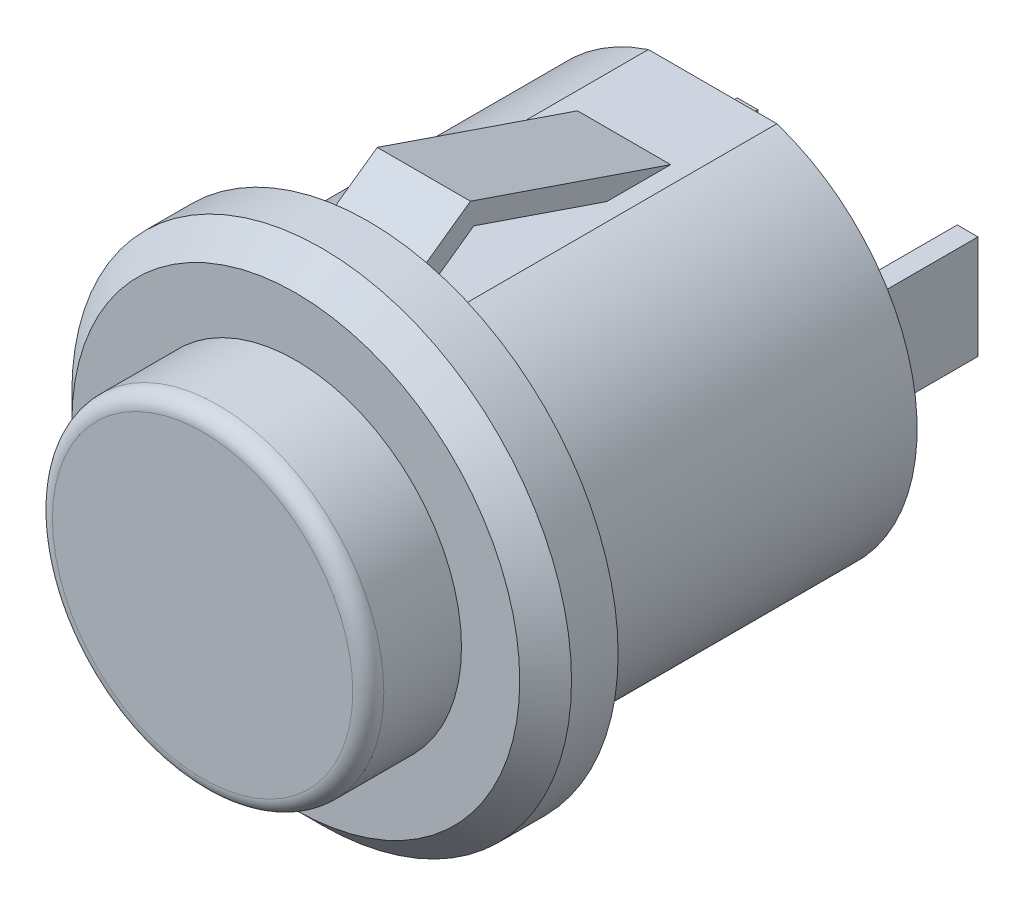
ISO-10303-21;
HEADER;
FILE_DESCRIPTION(('STEP AP214'),'2;1');
FILE_NAME('part.step','',(''),(''),'','','');
FILE_SCHEMA(('AUTOMOTIVE_DESIGN { 1 0 10303 214 1 1 1 1 }'));
ENDSEC;
DATA;
#1=APPLICATION_CONTEXT('core data for automotive mechanical design processes');
#2=APPLICATION_PROTOCOL_DEFINITION('international standard','automotive_design',2000,#1);
#3=PRODUCT_CONTEXT('',#1,'mechanical');
#4=PRODUCT('Part','Part','',(#3));
#5=PRODUCT_RELATED_PRODUCT_CATEGORY('part','',(#4));
#6=PRODUCT_DEFINITION_FORMATION('','',#4);
#7=PRODUCT_DEFINITION_CONTEXT('part definition',#1,'design');
#8=PRODUCT_DEFINITION('design','',#6,#7);
#9=PRODUCT_DEFINITION_SHAPE('','',#8);
#10=(LENGTH_UNIT() NAMED_UNIT(*) SI_UNIT(.MILLI.,.METRE.));
#11=(NAMED_UNIT(*) PLANE_ANGLE_UNIT() SI_UNIT($,.RADIAN.));
#12=(NAMED_UNIT(*) SI_UNIT($,.STERADIAN.) SOLID_ANGLE_UNIT());
#13=UNCERTAINTY_MEASURE_WITH_UNIT(LENGTH_MEASURE(1.E-05),#10,'distance_accuracy_value','');
#14=(GEOMETRIC_REPRESENTATION_CONTEXT(3) GLOBAL_UNCERTAINTY_ASSIGNED_CONTEXT((#13)) GLOBAL_UNIT_ASSIGNED_CONTEXT((#10,
#11,#12)) REPRESENTATION_CONTEXT('',''));
#15=CARTESIAN_POINT('',(0.,0.,0.));
#16=DIRECTION('',(0.,0.,1.));
#17=DIRECTION('',(1.,0.,0.));
#18=AXIS2_PLACEMENT_3D('',#15,#16,#17);
#19=CARTESIAN_POINT('',(0.,0.,0.));
#20=DIRECTION('',(0.,0.,1.));
#21=DIRECTION('',(1.,0.,0.));
#22=AXIS2_PLACEMENT_3D('',#19,#20,#21);
#23=PLANE('',#22);
#24=DIRECTION('',(0.,1.,0.));
#25=VECTOR('',#24,1.);
#26=CARTESIAN_POINT('',(-1.8,0.,0.));
#27=LINE('',#26,#25);
#28=CARTESIAN_POINT('',(-1.8,-8.62096384227763,0.));
#29=VERTEX_POINT('',#28);
#30=CARTESIAN_POINT('',(-1.8,-7.63980806123841,0.));
#31=VERTEX_POINT('',#30);
#32=EDGE_CURVE('E287',#29,#31,#27,.T.);
#33=ORIENTED_EDGE('',*,*,#32,.F.);
#34=DIRECTION('',(1.,0.,0.));
#35=VECTOR('',#34,1.);
#36=CARTESIAN_POINT('',(-1.8,-8.62096384227763,0.));
#37=LINE('',#36,#35);
#38=CARTESIAN_POINT('',(1.8,-8.62096384227763,0.));
#39=VERTEX_POINT('',#38);
#40=EDGE_CURVE('E307',#29,#39,#37,.T.);
#41=ORIENTED_EDGE('',*,*,#40,.T.);
#42=DIRECTION('',(0.,1.,0.));
#43=VECTOR('',#42,1.);
#44=CARTESIAN_POINT('',(1.8,0.,0.));
#45=LINE('',#44,#43);
#46=CARTESIAN_POINT('',(1.8,-7.63980806123841,0.));
#47=VERTEX_POINT('',#46);
#48=EDGE_CURVE('E264',#39,#47,#45,.T.);
#49=ORIENTED_EDGE('',*,*,#48,.T.);
#50=DIRECTION('',(1.,0.,0.));
#51=VECTOR('',#50,1.);
#52=CARTESIAN_POINT('',(-1.8,-7.63980806123841,0.));
#53=LINE('',#52,#51);
#54=EDGE_CURVE('E311',#31,#47,#53,.T.);
#55=ORIENTED_EDGE('',*,*,#54,.F.);
#56=EDGE_LOOP('',(#33,#41,#49,#55));
#57=FACE_BOUND('',#56,.T.);
#58=CARTESIAN_POINT('',(0.,0.,0.));
#59=DIRECTION('',(0.,0.,-1.));
#60=DIRECTION('',(-1.,0.,0.));
#61=AXIS2_PLACEMENT_3D('',#58,#59,#60);
#62=CIRCLE('',#61,7.9);
#63=CARTESIAN_POINT('',(2.48193472919817,7.5,0.));
#64=VERTEX_POINT('',#63);
#65=CARTESIAN_POINT('',(2.48193472919817,-7.5,0.));
#66=VERTEX_POINT('',#65);
#67=EDGE_CURVE('E11',#64,#66,#62,.T.);
#68=ORIENTED_EDGE('',*,*,#67,.F.);
#69=DIRECTION('',(-1.,0.,0.));
#70=VECTOR('',#69,1.);
#71=CARTESIAN_POINT('',(0.,7.5,0.));
#72=LINE('',#71,#70);
#73=CARTESIAN_POINT('',(-2.48193472919817,7.5,0.));
#74=VERTEX_POINT('',#73);
#75=EDGE_CURVE('E405',#64,#74,#72,.T.);
#76=ORIENTED_EDGE('',*,*,#75,.T.);
#77=CARTESIAN_POINT('',(-2.48193472919817,-7.5,0.));
#78=VERTEX_POINT('',#77);
#79=EDGE_CURVE('E65',#78,#74,#62,.T.);
#80=ORIENTED_EDGE('',*,*,#79,.F.);
#81=DIRECTION('',(-1.,0.,0.));
#82=VECTOR('',#81,1.);
#83=CARTESIAN_POINT('',(0.,-7.5,0.));
#84=LINE('',#83,#82);
#85=EDGE_CURVE('E401',#66,#78,#84,.T.);
#86=ORIENTED_EDGE('',*,*,#85,.F.);
#87=EDGE_LOOP('',(#68,#76,#80,#86));
#88=FACE_BOUND('',#87,.T.);
#89=CARTESIAN_POINT('',(0.,0.,0.));
#90=DIRECTION('',(0.,0.,1.));
#91=DIRECTION('',(1.,0.,0.));
#92=AXIS2_PLACEMENT_3D('',#89,#90,#91);
#93=CIRCLE('',#92,9.65);
#94=CARTESIAN_POINT('',(9.65,0.,0.));
#95=VERTEX_POINT('',#94);
#96=EDGE_CURVE('E442',#95,#95,#93,.T.);
#97=ORIENTED_EDGE('',*,*,#96,.F.);
#98=EDGE_LOOP('',(#97));
#99=FACE_BOUND('',#98,.T.);
#100=DIRECTION('',(0.,-1.,0.));
#101=VECTOR('',#100,1.);
#102=CARTESIAN_POINT('',(1.8,0.,0.));
#103=LINE('',#102,#101);
#104=CARTESIAN_POINT('',(1.8,8.62096384227763,0.));
#105=VERTEX_POINT('',#104);
#106=CARTESIAN_POINT('',(1.8,7.63980806123841,0.));
#107=VERTEX_POINT('',#106);
#108=EDGE_CURVE('E516',#105,#107,#103,.T.);
#109=ORIENTED_EDGE('',*,*,#108,.F.);
#110=DIRECTION('',(-1.,0.,0.));
#111=VECTOR('',#110,1.);
#112=CARTESIAN_POINT('',(1.8,8.62096384227763,0.));
#113=LINE('',#112,#111);
#114=CARTESIAN_POINT('',(-1.8,8.62096384227763,0.));
#115=VERTEX_POINT('',#114);
#116=EDGE_CURVE('E518',#105,#115,#113,.T.);
#117=ORIENTED_EDGE('',*,*,#116,.T.);
#118=DIRECTION('',(0.,-1.,0.));
#119=VECTOR('',#118,1.);
#120=CARTESIAN_POINT('',(-1.8,0.,0.));
#121=LINE('',#120,#119);
#122=CARTESIAN_POINT('',(-1.8,7.63980806123841,0.));
#123=VERTEX_POINT('',#122);
#124=EDGE_CURVE('E542',#115,#123,#121,.T.);
#125=ORIENTED_EDGE('',*,*,#124,.T.);
#126=DIRECTION('',(-1.,0.,0.));
#127=VECTOR('',#126,1.);
#128=CARTESIAN_POINT('',(1.8,7.63980806123841,0.));
#129=LINE('',#128,#127);
#130=EDGE_CURVE('E245',#107,#123,#129,.T.);
#131=ORIENTED_EDGE('',*,*,#130,.F.);
#132=EDGE_LOOP('',(#109,#117,#125,#131));
#133=FACE_BOUND('',#132,.T.);
#134=ADVANCED_FACE('F55',(#57,#88,#99,#133),#23,.F.);
#135=CARTESIAN_POINT('',(0.,7.5,4.9799598391955));
#136=DIRECTION('',(0.,-1.,0.));
#137=DIRECTION('',(0.,0.,-1.));
#138=AXIS2_PLACEMENT_3D('',#135,#136,#137);
#139=PLANE('',#138);
#140=DIRECTION('',(0.,0.,-1.));
#141=VECTOR('',#140,1.);
#142=CARTESIAN_POINT('',(2.48193472919817,7.5,4.9799598391955));
#143=LINE('',#142,#141);
#144=CARTESIAN_POINT('',(2.48193472919817,7.5,-13.3));
#145=VERTEX_POINT('',#144);
#146=EDGE_CURVE('E414',#64,#145,#143,.T.);
#147=ORIENTED_EDGE('',*,*,#146,.T.);
#148=DIRECTION('',(-1.,0.,0.));
#149=VECTOR('',#148,1.);
#150=CARTESIAN_POINT('',(0.,7.5,-13.3));
#151=LINE('',#150,#149);
#152=CARTESIAN_POINT('',(-2.48193472919817,7.5,-13.3));
#153=VERTEX_POINT('',#152);
#154=EDGE_CURVE('E402',#145,#153,#151,.T.);
#155=ORIENTED_EDGE('',*,*,#154,.T.);
#156=DIRECTION('',(0.,0.,-1.));
#157=VECTOR('',#156,1.);
#158=CARTESIAN_POINT('',(-2.48193472919817,7.5,4.9799598391955));
#159=LINE('',#158,#157);
#160=EDGE_CURVE('E410',#74,#153,#159,.T.);
#161=ORIENTED_EDGE('',*,*,#160,.F.);
#162=ORIENTED_EDGE('',*,*,#75,.F.);
#163=EDGE_LOOP('',(#147,#155,#161,#162));
#164=FACE_BOUND('',#163,.T.);
#165=DIRECTION('',(0.,0.,-1.));
#166=VECTOR('',#165,1.);
#167=CARTESIAN_POINT('',(1.8,7.5,0.));
#168=LINE('',#167,#166);
#169=CARTESIAN_POINT('',(1.8,7.5,-7.40849738369976));
#170=VERTEX_POINT('',#169);
#171=CARTESIAN_POINT('',(1.8,7.5,-9.88122465642703));
#172=VERTEX_POINT('',#171);
#173=EDGE_CURVE('E239',#170,#172,#168,.T.);
#174=ORIENTED_EDGE('',*,*,#173,.F.);
#175=DIRECTION('',(-1.,0.,0.));
#176=VECTOR('',#175,1.);
#177=CARTESIAN_POINT('',(1.8,7.5,-7.40849738369976));
#178=LINE('',#177,#176);
#179=CARTESIAN_POINT('',(-1.8,7.5,-7.40849738369976));
#180=VERTEX_POINT('',#179);
#181=EDGE_CURVE('E232',#170,#180,#178,.T.);
#182=ORIENTED_EDGE('',*,*,#181,.T.);
#183=DIRECTION('',(0.,0.,-1.));
#184=VECTOR('',#183,1.);
#185=CARTESIAN_POINT('',(-1.8,7.5,0.));
#186=LINE('',#185,#184);
#187=CARTESIAN_POINT('',(-1.8,7.5,-9.88122465642703));
#188=VERTEX_POINT('',#187);
#189=EDGE_CURVE('E219',#180,#188,#186,.T.);
#190=ORIENTED_EDGE('',*,*,#189,.T.);
#191=DIRECTION('',(-1.,0.,0.));
#192=VECTOR('',#191,1.);
#193=CARTESIAN_POINT('',(1.8,7.5,-9.88122465642703));
#194=LINE('',#193,#192);
#195=EDGE_CURVE('E256',#172,#188,#194,.T.);
#196=ORIENTED_EDGE('',*,*,#195,.F.);
#197=EDGE_LOOP('',(#174,#182,#190,#196));
#198=FACE_BOUND('',#197,.T.);
#199=ADVANCED_FACE('F238',(#164,#198),#139,.F.);
#200=CARTESIAN_POINT('',(0.,-7.5,4.9799598391955));
#201=DIRECTION('',(0.,-1.,0.));
#202=DIRECTION('',(0.,0.,-1.));
#203=AXIS2_PLACEMENT_3D('',#200,#201,#202);
#204=PLANE('',#203);
#205=ORIENTED_EDGE('',*,*,#85,.T.);
#206=DIRECTION('',(0.,0.,-1.));
#207=VECTOR('',#206,1.);
#208=CARTESIAN_POINT('',(-2.48193472919817,-7.5,4.9799598391955));
#209=LINE('',#208,#207);
#210=CARTESIAN_POINT('',(-2.48193472919817,-7.5,-13.3));
#211=VERTEX_POINT('',#210);
#212=EDGE_CURVE('E424',#78,#211,#209,.T.);
#213=ORIENTED_EDGE('',*,*,#212,.T.);
#214=DIRECTION('',(-1.,0.,0.));
#215=VECTOR('',#214,1.);
#216=CARTESIAN_POINT('',(0.,-7.5,-13.3));
#217=LINE('',#216,#215);
#218=CARTESIAN_POINT('',(2.48193472919817,-7.5,-13.3));
#219=VERTEX_POINT('',#218);
#220=EDGE_CURVE('E406',#219,#211,#217,.T.);
#221=ORIENTED_EDGE('',*,*,#220,.F.);
#222=DIRECTION('',(0.,0.,-1.));
#223=VECTOR('',#222,1.);
#224=CARTESIAN_POINT('',(2.48193472919817,-7.5,4.9799598391955));
#225=LINE('',#224,#223);
#226=EDGE_CURVE('E421',#66,#219,#225,.T.);
#227=ORIENTED_EDGE('',*,*,#226,.F.);
#228=EDGE_LOOP('',(#205,#213,#221,#227));
#229=FACE_BOUND('',#228,.T.);
#230=DIRECTION('',(1.,0.,0.));
#231=VECTOR('',#230,1.);
#232=CARTESIAN_POINT('',(-1.8,-7.5,-9.88122465642703));
#233=LINE('',#232,#231);
#234=CARTESIAN_POINT('',(-1.8,-7.5,-9.88122465642703));
#235=VERTEX_POINT('',#234);
#236=CARTESIAN_POINT('',(1.8,-7.5,-9.88122465642703));
#237=VERTEX_POINT('',#236);
#238=EDGE_CURVE('E299',#235,#237,#233,.T.);
#239=ORIENTED_EDGE('',*,*,#238,.F.);
#240=DIRECTION('',(0.,0.,-1.));
#241=VECTOR('',#240,1.);
#242=CARTESIAN_POINT('',(-1.8,-7.5,0.));
#243=LINE('',#242,#241);
#244=CARTESIAN_POINT('',(-1.8,-7.5,-7.40849738369976));
#245=VERTEX_POINT('',#244);
#246=EDGE_CURVE('E276',#245,#235,#243,.T.);
#247=ORIENTED_EDGE('',*,*,#246,.F.);
#248=DIRECTION('',(1.,0.,0.));
#249=VECTOR('',#248,1.);
#250=CARTESIAN_POINT('',(-1.8,-7.5,-7.40849738369976));
#251=LINE('',#250,#249);
#252=CARTESIAN_POINT('',(1.8,-7.5,-7.40849738369976));
#253=VERTEX_POINT('',#252);
#254=EDGE_CURVE('E298',#245,#253,#251,.T.);
#255=ORIENTED_EDGE('',*,*,#254,.T.);
#256=DIRECTION('',(0.,0.,-1.));
#257=VECTOR('',#256,1.);
#258=CARTESIAN_POINT('',(1.8,-7.5,0.));
#259=LINE('',#258,#257);
#260=EDGE_CURVE('E252',#253,#237,#259,.T.);
#261=ORIENTED_EDGE('',*,*,#260,.T.);
#262=EDGE_LOOP('',(#239,#247,#255,#261));
#263=FACE_BOUND('',#262,.T.);
#264=ADVANCED_FACE('F481',(#229,#263),#204,.T.);
#265=CARTESIAN_POINT('',(0.,0.,-13.3));
#266=DIRECTION('',(0.,0.,-1.));
#267=DIRECTION('',(-1.,0.,0.));
#268=AXIS2_PLACEMENT_3D('',#265,#266,#267);
#269=PLANE('',#268);
#270=ORIENTED_EDGE('',*,*,#154,.F.);
#271=CARTESIAN_POINT('',(0.,0.,-13.3));
#272=DIRECTION('',(0.,0.,-1.));
#273=DIRECTION('',(-1.,0.,0.));
#274=AXIS2_PLACEMENT_3D('',#271,#272,#273);
#275=CIRCLE('',#274,7.9);
#276=EDGE_CURVE('E432',#145,#219,#275,.T.);
#277=ORIENTED_EDGE('',*,*,#276,.T.);
#278=ORIENTED_EDGE('',*,*,#220,.T.);
#279=EDGE_CURVE('E417',#211,#153,#275,.T.);
#280=ORIENTED_EDGE('',*,*,#279,.T.);
#281=EDGE_LOOP('',(#270,#277,#278,#280));
#282=FACE_BOUND('',#281,.T.);
#283=DIRECTION('',(1.,0.,0.));
#284=VECTOR('',#283,1.);
#285=CARTESIAN_POINT('',(4.65,2.,-13.3));
#286=LINE('',#285,#284);
#287=CARTESIAN_POINT('',(3.85,2.,-13.3));
#288=VERTEX_POINT('',#287);
#289=CARTESIAN_POINT('',(4.65,2.,-13.3));
#290=VERTEX_POINT('',#289);
#291=EDGE_CURVE('E379',#288,#290,#286,.T.);
#292=ORIENTED_EDGE('',*,*,#291,.F.);
#293=DIRECTION('',(0.,1.,0.));
#294=VECTOR('',#293,1.);
#295=CARTESIAN_POINT('',(3.85,2.,-13.3));
#296=LINE('',#295,#294);
#297=CARTESIAN_POINT('',(3.85,-2.,-13.3));
#298=VERTEX_POINT('',#297);
#299=EDGE_CURVE('E349',#298,#288,#296,.T.);
#300=ORIENTED_EDGE('',*,*,#299,.F.);
#301=DIRECTION('',(-1.,0.,0.));
#302=VECTOR('',#301,1.);
#303=CARTESIAN_POINT('',(4.65,-2.,-13.3));
#304=LINE('',#303,#302);
#305=CARTESIAN_POINT('',(4.65,-2.,-13.3));
#306=VERTEX_POINT('',#305);
#307=EDGE_CURVE('E366',#306,#298,#304,.T.);
#308=ORIENTED_EDGE('',*,*,#307,.F.);
#309=DIRECTION('',(0.,-1.,0.));
#310=VECTOR('',#309,1.);
#311=CARTESIAN_POINT('',(4.65,2.,-13.3));
#312=LINE('',#311,#310);
#313=EDGE_CURVE('E382',#290,#306,#312,.T.);
#314=ORIENTED_EDGE('',*,*,#313,.F.);
#315=EDGE_LOOP('',(#292,#300,#308,#314));
#316=FACE_BOUND('',#315,.T.);
#317=DIRECTION('',(1.,0.,0.));
#318=VECTOR('',#317,1.);
#319=CARTESIAN_POINT('',(-4.65,2.,-13.3));
#320=LINE('',#319,#318);
#321=CARTESIAN_POINT('',(-4.65,2.,-13.3));
#322=VERTEX_POINT('',#321);
#323=CARTESIAN_POINT('',(-3.85,2.,-13.3));
#324=VERTEX_POINT('',#323);
#325=EDGE_CURVE('E342',#322,#324,#320,.T.);
#326=ORIENTED_EDGE('',*,*,#325,.F.);
#327=DIRECTION('',(0.,1.,0.));
#328=VECTOR('',#327,1.);
#329=CARTESIAN_POINT('',(-4.65,2.,-13.3));
#330=LINE('',#329,#328);
#331=CARTESIAN_POINT('',(-4.65,-2.,-13.3));
#332=VERTEX_POINT('',#331);
#333=EDGE_CURVE('E345',#332,#322,#330,.T.);
#334=ORIENTED_EDGE('',*,*,#333,.F.);
#335=DIRECTION('',(-1.,0.,0.));
#336=VECTOR('',#335,1.);
#337=CARTESIAN_POINT('',(-4.65,-2.,-13.3));
#338=LINE('',#337,#336);
#339=CARTESIAN_POINT('',(-3.85,-2.,-13.3));
#340=VERTEX_POINT('',#339);
#341=EDGE_CURVE('E334',#340,#332,#338,.T.);
#342=ORIENTED_EDGE('',*,*,#341,.F.);
#343=DIRECTION('',(0.,-1.,0.));
#344=VECTOR('',#343,1.);
#345=CARTESIAN_POINT('',(-3.85,2.,-13.3));
#346=LINE('',#345,#344);
#347=EDGE_CURVE('E337',#324,#340,#346,.T.);
#348=ORIENTED_EDGE('',*,*,#347,.F.);
#349=EDGE_LOOP('',(#326,#334,#342,#348));
#350=FACE_BOUND('',#349,.T.);
#351=ADVANCED_FACE('F634',(#282,#316,#350),#269,.T.);
#352=CARTESIAN_POINT('',(0.,0.,-13.3));
#353=DIRECTION('',(0.,0.,1.));
#354=DIRECTION('',(1.,0.,0.));
#355=AXIS2_PLACEMENT_3D('',#352,#353,#354);
#356=CYLINDRICAL_SURFACE('',#355,7.9);
#357=ORIENTED_EDGE('',*,*,#276,.F.);
#358=ORIENTED_EDGE('',*,*,#146,.F.);
#359=ORIENTED_EDGE('',*,*,#67,.T.);
#360=ORIENTED_EDGE('',*,*,#226,.T.);
#361=EDGE_LOOP('',(#357,#358,#359,#360));
#362=FACE_BOUND('',#361,.T.);
#363=ADVANCED_FACE('F638',(#362),#356,.T.);
#364=ORIENTED_EDGE('',*,*,#79,.T.);
#365=ORIENTED_EDGE('',*,*,#160,.T.);
#366=ORIENTED_EDGE('',*,*,#279,.F.);
#367=ORIENTED_EDGE('',*,*,#212,.F.);
#368=EDGE_LOOP('',(#364,#365,#366,#367));
#369=FACE_BOUND('',#368,.T.);
#370=ADVANCED_FACE('F492',(#369),#356,.T.);
#371=CARTESIAN_POINT('',(0.,0.,2.8));
#372=DIRECTION('',(0.,0.,-1.));
#373=DIRECTION('',(-1.,0.,0.));
#374=AXIS2_PLACEMENT_3D('',#371,#372,#373);
#375=CYLINDRICAL_SURFACE('',#374,9.65);
#376=CARTESIAN_POINT('',(0.,0.,1.8));
#377=DIRECTION('',(0.,0.,1.));
#378=DIRECTION('',(1.,0.,0.));
#379=AXIS2_PLACEMENT_3D('',#376,#377,#378);
#380=CIRCLE('',#379,9.65);
#381=CARTESIAN_POINT('',(9.65,0.,1.8));
#382=VERTEX_POINT('',#381);
#383=EDGE_CURVE('E441',#382,#382,#380,.F.);
#384=ORIENTED_EDGE('',*,*,#383,.T.);
#385=EDGE_LOOP('',(#384));
#386=FACE_BOUND('',#385,.T.);
#387=ORIENTED_EDGE('',*,*,#96,.T.);
#388=EDGE_LOOP('',(#387));
#389=FACE_BOUND('',#388,.T.);
#390=ADVANCED_FACE('F490',(#386,#389),#375,.T.);
#391=CARTESIAN_POINT('',(0.,0.,2.8));
#392=DIRECTION('',(0.,0.,1.));
#393=DIRECTION('',(1.,0.,0.));
#394=AXIS2_PLACEMENT_3D('',#391,#392,#393);
#395=PLANE('',#394);
#396=CARTESIAN_POINT('',(0.,0.,2.8));
#397=DIRECTION('',(0.,0.,1.));
#398=DIRECTION('',(1.,0.,0.));
#399=AXIS2_PLACEMENT_3D('',#396,#397,#398);
#400=CIRCLE('',#399,6.4);
#401=CARTESIAN_POINT('',(6.4,0.,2.8));
#402=VERTEX_POINT('',#401);
#403=EDGE_CURVE('E436',#402,#402,#400,.T.);
#404=ORIENTED_EDGE('',*,*,#403,.F.);
#405=EDGE_LOOP('',(#404));
#406=FACE_BOUND('',#405,.T.);
#407=CARTESIAN_POINT('',(0.,0.,2.8));
#408=DIRECTION('',(0.,0.,1.));
#409=DIRECTION('',(1.,0.,0.));
#410=AXIS2_PLACEMENT_3D('',#407,#408,#409);
#411=CIRCLE('',#410,8.65);
#412=CARTESIAN_POINT('',(8.65,0.,2.8));
#413=VERTEX_POINT('',#412);
#414=EDGE_CURVE('E446',#413,#413,#411,.T.);
#415=ORIENTED_EDGE('',*,*,#414,.T.);
#416=EDGE_LOOP('',(#415));
#417=FACE_BOUND('',#416,.T.);
#418=ADVANCED_FACE('F488',(#406,#417),#395,.T.);
#419=CARTESIAN_POINT('',(0.,0.,2.8));
#420=DIRECTION('',(0.,0.,-1.));
#421=DIRECTION('',(-1.,0.,0.));
#422=AXIS2_PLACEMENT_3D('',#419,#420,#421);
#423=CONICAL_SURFACE('',#422,8.65,0.785398163397447);
#424=ORIENTED_EDGE('',*,*,#383,.F.);
#425=EDGE_LOOP('',(#424));
#426=FACE_BOUND('',#425,.T.);
#427=ORIENTED_EDGE('',*,*,#414,.F.);
#428=EDGE_LOOP('',(#427));
#429=FACE_BOUND('',#428,.T.);
#430=ADVANCED_FACE('F495',(#426,#429),#423,.T.);
#431=CARTESIAN_POINT('',(0.,0.,6.4));
#432=DIRECTION('',(0.,0.,-1.));
#433=DIRECTION('',(-1.,0.,0.));
#434=AXIS2_PLACEMENT_3D('',#431,#432,#433);
#435=CYLINDRICAL_SURFACE('',#434,6.4);
#436=CARTESIAN_POINT('',(0.,0.,5.8));
#437=DIRECTION('',(0.,0.,1.));
#438=DIRECTION('',(1.,0.,0.));
#439=AXIS2_PLACEMENT_3D('',#436,#437,#438);
#440=CIRCLE('',#439,6.4);
#441=CARTESIAN_POINT('',(6.4,0.,5.8));
#442=VERTEX_POINT('',#441);
#443=EDGE_CURVE('E59',#442,#442,#440,.F.);
#444=ORIENTED_EDGE('',*,*,#443,.T.);
#445=EDGE_LOOP('',(#444));
#446=FACE_BOUND('',#445,.T.);
#447=ORIENTED_EDGE('',*,*,#403,.T.);
#448=EDGE_LOOP('',(#447));
#449=FACE_BOUND('',#448,.T.);
#450=ADVANCED_FACE('F460',(#446,#449),#435,.T.);
#451=CARTESIAN_POINT('',(0.,0.,6.4));
#452=DIRECTION('',(0.,0.,1.));
#453=DIRECTION('',(1.,0.,0.));
#454=AXIS2_PLACEMENT_3D('',#451,#452,#453);
#455=PLANE('',#454);
#456=CARTESIAN_POINT('',(0.,0.,6.4));
#457=DIRECTION('',(0.,0.,1.));
#458=DIRECTION('',(1.,0.,0.));
#459=AXIS2_PLACEMENT_3D('',#456,#457,#458);
#460=CIRCLE('',#459,5.8);
#461=CARTESIAN_POINT('',(5.8,0.,6.4));
#462=VERTEX_POINT('',#461);
#463=EDGE_CURVE('E440',#462,#462,#460,.T.);
#464=ORIENTED_EDGE('',*,*,#463,.T.);
#465=EDGE_LOOP('',(#464));
#466=FACE_BOUND('',#465,.T.);
#467=ADVANCED_FACE('F466',(#466),#455,.T.);
#468=CARTESIAN_POINT('',(0.,0.,5.8));
#469=DIRECTION('',(0.,0.,1.));
#470=DIRECTION('',(1.,0.,0.));
#471=AXIS2_PLACEMENT_3D('',#468,#469,#470);
#472=TOROIDAL_SURFACE('',#471,5.8,0.6);
#473=ORIENTED_EDGE('',*,*,#443,.F.);
#474=EDGE_LOOP('',(#473));
#475=FACE_BOUND('',#474,.T.);
#476=ORIENTED_EDGE('',*,*,#463,.F.);
#477=EDGE_LOOP('',(#476));
#478=FACE_BOUND('',#477,.T.);
#479=ADVANCED_FACE('F57',(#475,#478),#472,.T.);
#480=CARTESIAN_POINT('',(3.85,2.,-18.9));
#481=DIRECTION('',(1.,0.,0.));
#482=DIRECTION('',(0.,1.,0.));
#483=AXIS2_PLACEMENT_3D('',#480,#481,#482);
#484=PLANE('',#483);
#485=ORIENTED_EDGE('',*,*,#299,.T.);
#486=DIRECTION('',(0.,0.,1.));
#487=VECTOR('',#486,1.);
#488=CARTESIAN_POINT('',(3.85,2.,-18.9));
#489=LINE('',#488,#487);
#490=CARTESIAN_POINT('',(3.85,2.,-18.9));
#491=VERTEX_POINT('',#490);
#492=EDGE_CURVE('E398',#491,#288,#489,.T.);
#493=ORIENTED_EDGE('',*,*,#492,.F.);
#494=DIRECTION('',(0.,1.,0.));
#495=VECTOR('',#494,1.);
#496=CARTESIAN_POINT('',(3.85,2.,-18.9));
#497=LINE('',#496,#495);
#498=CARTESIAN_POINT('',(3.85,-2.,-18.9));
#499=VERTEX_POINT('',#498);
#500=EDGE_CURVE('E361',#499,#491,#497,.T.);
#501=ORIENTED_EDGE('',*,*,#500,.F.);
#502=DIRECTION('',(0.,0.,1.));
#503=VECTOR('',#502,1.);
#504=CARTESIAN_POINT('',(3.85,-2.,-18.9));
#505=LINE('',#504,#503);
#506=EDGE_CURVE('E375',#499,#298,#505,.T.);
#507=ORIENTED_EDGE('',*,*,#506,.T.);
#508=EDGE_LOOP('',(#485,#493,#501,#507));
#509=FACE_BOUND('',#508,.T.);
#510=ADVANCED_FACE('F465',(#509),#484,.F.);
#511=CARTESIAN_POINT('',(4.65,2.,-18.9));
#512=DIRECTION('',(0.,-1.,0.));
#513=DIRECTION('',(0.,0.,-1.));
#514=AXIS2_PLACEMENT_3D('',#511,#512,#513);
#515=PLANE('',#514);
#516=ORIENTED_EDGE('',*,*,#291,.T.);
#517=DIRECTION('',(0.,0.,1.));
#518=VECTOR('',#517,1.);
#519=CARTESIAN_POINT('',(4.65,2.,-18.9));
#520=LINE('',#519,#518);
#521=CARTESIAN_POINT('',(4.65,2.,-18.9));
#522=VERTEX_POINT('',#521);
#523=EDGE_CURVE('E394',#522,#290,#520,.T.);
#524=ORIENTED_EDGE('',*,*,#523,.F.);
#525=DIRECTION('',(1.,0.,0.));
#526=VECTOR('',#525,1.);
#527=CARTESIAN_POINT('',(4.65,2.,-18.9));
#528=LINE('',#527,#526);
#529=EDGE_CURVE('E365',#491,#522,#528,.T.);
#530=ORIENTED_EDGE('',*,*,#529,.F.);
#531=ORIENTED_EDGE('',*,*,#492,.T.);
#532=EDGE_LOOP('',(#516,#524,#530,#531));
#533=FACE_BOUND('',#532,.T.);
#534=ADVANCED_FACE('F471',(#533),#515,.F.);
#535=CARTESIAN_POINT('',(4.65,2.,-18.9));
#536=DIRECTION('',(-1.,0.,0.));
#537=DIRECTION('',(0.,-1.,0.));
#538=AXIS2_PLACEMENT_3D('',#535,#536,#537);
#539=PLANE('',#538);
#540=ORIENTED_EDGE('',*,*,#313,.T.);
#541=DIRECTION('',(0.,0.,1.));
#542=VECTOR('',#541,1.);
#543=CARTESIAN_POINT('',(4.65,-2.,-18.9));
#544=LINE('',#543,#542);
#545=CARTESIAN_POINT('',(4.65,-2.,-18.9));
#546=VERTEX_POINT('',#545);
#547=EDGE_CURVE('E391',#546,#306,#544,.T.);
#548=ORIENTED_EDGE('',*,*,#547,.F.);
#549=DIRECTION('',(0.,-1.,0.));
#550=VECTOR('',#549,1.);
#551=CARTESIAN_POINT('',(4.65,2.,-18.9));
#552=LINE('',#551,#550);
#553=EDGE_CURVE('E369',#522,#546,#552,.T.);
#554=ORIENTED_EDGE('',*,*,#553,.F.);
#555=ORIENTED_EDGE('',*,*,#523,.T.);
#556=EDGE_LOOP('',(#540,#548,#554,#555));
#557=FACE_BOUND('',#556,.T.);
#558=ADVANCED_FACE('F624',(#557),#539,.F.);
#559=CARTESIAN_POINT('',(4.65,-2.,-18.9));
#560=DIRECTION('',(0.,1.,0.));
#561=DIRECTION('',(0.,0.,1.));
#562=AXIS2_PLACEMENT_3D('',#559,#560,#561);
#563=PLANE('',#562);
#564=ORIENTED_EDGE('',*,*,#307,.T.);
#565=ORIENTED_EDGE('',*,*,#506,.F.);
#566=DIRECTION('',(-1.,0.,0.));
#567=VECTOR('',#566,1.);
#568=CARTESIAN_POINT('',(4.65,-2.,-18.9));
#569=LINE('',#568,#567);
#570=EDGE_CURVE('E372',#546,#499,#569,.T.);
#571=ORIENTED_EDGE('',*,*,#570,.F.);
#572=ORIENTED_EDGE('',*,*,#547,.T.);
#573=EDGE_LOOP('',(#564,#565,#571,#572));
#574=FACE_BOUND('',#573,.T.);
#575=ADVANCED_FACE('F620',(#574),#563,.F.);
#576=CARTESIAN_POINT('',(0.,0.,-18.9));
#577=DIRECTION('',(0.,0.,-1.));
#578=DIRECTION('',(-1.,0.,0.));
#579=AXIS2_PLACEMENT_3D('',#576,#577,#578);
#580=PLANE('',#579);
#581=ORIENTED_EDGE('',*,*,#500,.T.);
#582=ORIENTED_EDGE('',*,*,#529,.T.);
#583=ORIENTED_EDGE('',*,*,#553,.T.);
#584=ORIENTED_EDGE('',*,*,#570,.T.);
#585=EDGE_LOOP('',(#581,#582,#583,#584));
#586=FACE_BOUND('',#585,.T.);
#587=ADVANCED_FACE('F602',(#586),#580,.T.);
#588=CARTESIAN_POINT('',(-4.65,2.,-18.9));
#589=DIRECTION('',(1.,0.,0.));
#590=DIRECTION('',(0.,1.,0.));
#591=AXIS2_PLACEMENT_3D('',#588,#589,#590);
#592=PLANE('',#591);
#593=ORIENTED_EDGE('',*,*,#333,.T.);
#594=DIRECTION('',(0.,0.,1.));
#595=VECTOR('',#594,1.);
#596=CARTESIAN_POINT('',(-4.65,2.,-18.9));
#597=LINE('',#596,#595);
#598=CARTESIAN_POINT('',(-4.65,2.,-18.9));
#599=VERTEX_POINT('',#598);
#600=EDGE_CURVE('E303',#599,#322,#597,.T.);
#601=ORIENTED_EDGE('',*,*,#600,.F.);
#602=DIRECTION('',(0.,1.,0.));
#603=VECTOR('',#602,1.);
#604=CARTESIAN_POINT('',(-4.65,2.,-18.9));
#605=LINE('',#604,#603);
#606=CARTESIAN_POINT('',(-4.65,-2.,-18.9));
#607=VERTEX_POINT('',#606);
#608=EDGE_CURVE('E338',#607,#599,#605,.T.);
#609=ORIENTED_EDGE('',*,*,#608,.F.);
#610=DIRECTION('',(0.,0.,1.));
#611=VECTOR('',#610,1.);
#612=CARTESIAN_POINT('',(-4.65,-2.,-18.9));
#613=LINE('',#612,#611);
#614=EDGE_CURVE('E329',#607,#332,#613,.T.);
#615=ORIENTED_EDGE('',*,*,#614,.T.);
#616=EDGE_LOOP('',(#593,#601,#609,#615));
#617=FACE_BOUND('',#616,.T.);
#618=ADVANCED_FACE('F598',(#617),#592,.F.);
#619=CARTESIAN_POINT('',(-4.65,2.,-18.9));
#620=DIRECTION('',(0.,-1.,0.));
#621=DIRECTION('',(0.,0.,-1.));
#622=AXIS2_PLACEMENT_3D('',#619,#620,#621);
#623=PLANE('',#622);
#624=ORIENTED_EDGE('',*,*,#325,.T.);
#625=DIRECTION('',(0.,0.,1.));
#626=VECTOR('',#625,1.);
#627=CARTESIAN_POINT('',(-3.85,2.,-18.9));
#628=LINE('',#627,#626);
#629=CARTESIAN_POINT('',(-3.85,2.,-18.9));
#630=VERTEX_POINT('',#629);
#631=EDGE_CURVE('E322',#630,#324,#628,.T.);
#632=ORIENTED_EDGE('',*,*,#631,.F.);
#633=DIRECTION('',(1.,0.,0.));
#634=VECTOR('',#633,1.);
#635=CARTESIAN_POINT('',(-4.65,2.,-18.9));
#636=LINE('',#635,#634);
#637=EDGE_CURVE('E355',#599,#630,#636,.T.);
#638=ORIENTED_EDGE('',*,*,#637,.F.);
#639=ORIENTED_EDGE('',*,*,#600,.T.);
#640=EDGE_LOOP('',(#624,#632,#638,#639));
#641=FACE_BOUND('',#640,.T.);
#642=ADVANCED_FACE('F601',(#641),#623,.F.);
#643=CARTESIAN_POINT('',(-3.85,2.,-18.9));
#644=DIRECTION('',(-1.,0.,0.));
#645=DIRECTION('',(0.,-1.,0.));
#646=AXIS2_PLACEMENT_3D('',#643,#644,#645);
#647=PLANE('',#646);
#648=ORIENTED_EDGE('',*,*,#347,.T.);
#649=DIRECTION('',(0.,0.,1.));
#650=VECTOR('',#649,1.);
#651=CARTESIAN_POINT('',(-3.85,-2.,-18.9));
#652=LINE('',#651,#650);
#653=CARTESIAN_POINT('',(-3.85,-2.,-18.9));
#654=VERTEX_POINT('',#653);
#655=EDGE_CURVE('E326',#654,#340,#652,.T.);
#656=ORIENTED_EDGE('',*,*,#655,.F.);
#657=DIRECTION('',(0.,-1.,0.));
#658=VECTOR('',#657,1.);
#659=CARTESIAN_POINT('',(-3.85,2.,-18.9));
#660=LINE('',#659,#658);
#661=EDGE_CURVE('E352',#630,#654,#660,.T.);
#662=ORIENTED_EDGE('',*,*,#661,.F.);
#663=ORIENTED_EDGE('',*,*,#631,.T.);
#664=EDGE_LOOP('',(#648,#656,#662,#663));
#665=FACE_BOUND('',#664,.T.);
#666=ADVANCED_FACE('F606',(#665),#647,.F.);
#667=CARTESIAN_POINT('',(-4.65,-2.,-18.9));
#668=DIRECTION('',(0.,1.,0.));
#669=DIRECTION('',(0.,0.,1.));
#670=AXIS2_PLACEMENT_3D('',#667,#668,#669);
#671=PLANE('',#670);
#672=ORIENTED_EDGE('',*,*,#341,.T.);
#673=ORIENTED_EDGE('',*,*,#614,.F.);
#674=DIRECTION('',(-1.,0.,0.));
#675=VECTOR('',#674,1.);
#676=CARTESIAN_POINT('',(-4.65,-2.,-18.9));
#677=LINE('',#676,#675);
#678=EDGE_CURVE('E333',#654,#607,#677,.T.);
#679=ORIENTED_EDGE('',*,*,#678,.F.);
#680=ORIENTED_EDGE('',*,*,#655,.T.);
#681=EDGE_LOOP('',(#672,#673,#679,#680));
#682=FACE_BOUND('',#681,.T.);
#683=ADVANCED_FACE('F610',(#682),#671,.F.);
#684=CARTESIAN_POINT('',(0.,0.,-18.9));
#685=DIRECTION('',(0.,0.,1.));
#686=DIRECTION('',(1.,0.,0.));
#687=AXIS2_PLACEMENT_3D('',#684,#685,#686);
#688=PLANE('',#687);
#689=ORIENTED_EDGE('',*,*,#608,.T.);
#690=ORIENTED_EDGE('',*,*,#637,.T.);
#691=ORIENTED_EDGE('',*,*,#661,.T.);
#692=ORIENTED_EDGE('',*,*,#678,.T.);
#693=EDGE_LOOP('',(#689,#690,#691,#692));
#694=FACE_BOUND('',#693,.T.);
#695=ADVANCED_FACE('F586',(#694),#688,.F.);
#696=CARTESIAN_POINT('',(-1.8,-9.73989867348464,-3.33025085975923));
#697=DIRECTION('',(0.,-0.946218114243848,-0.323529411764706));
#698=DIRECTION('',(0.,0.323529411764706,-0.946218114243848));
#699=AXIS2_PLACEMENT_3D('',#696,#697,#698);
#700=PLANE('',#699);
#701=ORIENTED_EDGE('',*,*,#238,.T.);
#702=DIRECTION('',(0.,0.323529411764706,-0.946218114243848));
#703=VECTOR('',#702,1.);
#704=CARTESIAN_POINT('',(1.8,-9.73989867348464,-3.33025085975923));
#705=LINE('',#704,#703);
#706=CARTESIAN_POINT('',(1.8,-10.1447861999856,-2.14608676872059));
#707=VERTEX_POINT('',#706);
#708=EDGE_CURVE('E272',#707,#237,#705,.T.);
#709=ORIENTED_EDGE('',*,*,#708,.F.);
#710=DIRECTION('',(1.,0.,0.));
#711=VECTOR('',#710,1.);
#712=CARTESIAN_POINT('',(-1.8,-10.1447861999856,-2.14608676872059));
#713=LINE('',#712,#711);
#714=CARTESIAN_POINT('',(-1.8,-10.1447861999856,-2.14608676872059));
#715=VERTEX_POINT('',#714);
#716=EDGE_CURVE('E304',#715,#707,#713,.T.);
#717=ORIENTED_EDGE('',*,*,#716,.F.);
#718=DIRECTION('',(0.,0.323529411764706,-0.946218114243848));
#719=VECTOR('',#718,1.);
#720=CARTESIAN_POINT('',(-1.8,-9.73989867348464,-3.33025085975923));
#721=LINE('',#720,#719);
#722=EDGE_CURVE('E294',#715,#235,#721,.T.);
#723=ORIENTED_EDGE('',*,*,#722,.T.);
#724=EDGE_LOOP('',(#701,#709,#717,#723));
#725=FACE_BOUND('',#724,.T.);
#726=ADVANCED_FACE('F582',(#725),#700,.T.);
#727=CARTESIAN_POINT('',(-1.8,-5.73138870400729,4.06955505023128));
#728=DIRECTION('',(0.,-0.815364914991035,0.578947368421053));
#729=DIRECTION('',(0.,-0.578947368421053,-0.815364914991035));
#730=AXIS2_PLACEMENT_3D('',#727,#728,#729);
#731=PLANE('',#730);
#732=ORIENTED_EDGE('',*,*,#716,.T.);
#733=DIRECTION('',(0.,-0.578947368421053,-0.815364914991035));
#734=VECTOR('',#733,1.);
#735=CARTESIAN_POINT('',(1.8,-5.73138870400729,4.06955505023128));
#736=LINE('',#735,#734);
#737=EDGE_CURVE('E268',#39,#707,#736,.T.);
#738=ORIENTED_EDGE('',*,*,#737,.F.);
#739=ORIENTED_EDGE('',*,*,#40,.F.);
#740=DIRECTION('',(0.,-0.578947368421053,-0.815364914991035));
#741=VECTOR('',#740,1.);
#742=CARTESIAN_POINT('',(-1.8,-5.73138870400729,4.06955505023128));
#743=LINE('',#742,#741);
#744=EDGE_CURVE('E290',#29,#715,#743,.T.);
#745=ORIENTED_EDGE('',*,*,#744,.T.);
#746=EDGE_LOOP('',(#732,#738,#739,#745));
#747=FACE_BOUND('',#746,.T.);
#748=ADVANCED_FACE('F585',(#747),#731,.T.);
#749=CARTESIAN_POINT('',(-1.8,-5.07909677201446,3.60639715549444));
#750=DIRECTION('',(0.,-0.815364914991035,0.578947368421053));
#751=DIRECTION('',(0.,-0.578947368421053,-0.815364914991035));
#752=AXIS2_PLACEMENT_3D('',#749,#750,#751);
#753=PLANE('',#752);
#754=ORIENTED_EDGE('',*,*,#54,.T.);
#755=DIRECTION('',(0.,-0.578947368421053,-0.815364914991035));
#756=VECTOR('',#755,1.);
#757=CARTESIAN_POINT('',(1.8,-5.07909677201446,3.60639715549444));
#758=LINE('',#757,#756);
#759=CARTESIAN_POINT('',(1.8,-9.25521380001437,-2.27506891768987));
#760=VERTEX_POINT('',#759);
#761=EDGE_CURVE('E260',#47,#760,#758,.T.);
#762=ORIENTED_EDGE('',*,*,#761,.T.);
#763=DIRECTION('',(1.,0.,0.));
#764=VECTOR('',#763,1.);
#765=CARTESIAN_POINT('',(-1.8,-9.25521380001437,-2.27506891768987));
#766=LINE('',#765,#764);
#767=CARTESIAN_POINT('',(-1.8,-9.25521380001437,-2.27506891768987));
#768=VERTEX_POINT('',#767);
#769=EDGE_CURVE('E315',#768,#760,#766,.T.);
#770=ORIENTED_EDGE('',*,*,#769,.F.);
#771=DIRECTION('',(0.,-0.578947368421053,-0.815364914991035));
#772=VECTOR('',#771,1.);
#773=CARTESIAN_POINT('',(-1.8,-5.07909677201446,3.60639715549444));
#774=LINE('',#773,#772);
#775=EDGE_CURVE('E284',#31,#768,#774,.T.);
#776=ORIENTED_EDGE('',*,*,#775,.F.);
#777=EDGE_LOOP('',(#754,#762,#770,#776));
#778=FACE_BOUND('',#777,.T.);
#779=ADVANCED_FACE('F590',(#778),#753,.F.);
#780=CARTESIAN_POINT('',(-1.8,-8.98292418208957,-3.07142733034746));
#781=DIRECTION('',(0.,-0.946218114243848,-0.323529411764706));
#782=DIRECTION('',(0.,0.323529411764706,-0.946218114243848));
#783=AXIS2_PLACEMENT_3D('',#780,#781,#782);
#784=PLANE('',#783);
#785=ORIENTED_EDGE('',*,*,#769,.T.);
#786=DIRECTION('',(0.,0.323529411764706,-0.946218114243848));
#787=VECTOR('',#786,1.);
#788=CARTESIAN_POINT('',(1.8,-8.98292418208957,-3.07142733034746));
#789=LINE('',#788,#787);
#790=EDGE_CURVE('E255',#760,#253,#789,.T.);
#791=ORIENTED_EDGE('',*,*,#790,.T.);
#792=ORIENTED_EDGE('',*,*,#254,.F.);
#793=DIRECTION('',(0.,0.323529411764706,-0.946218114243848));
#794=VECTOR('',#793,1.);
#795=CARTESIAN_POINT('',(-1.8,-8.98292418208957,-3.07142733034746));
#796=LINE('',#795,#794);
#797=EDGE_CURVE('E280',#768,#245,#796,.T.);
#798=ORIENTED_EDGE('',*,*,#797,.F.);
#799=EDGE_LOOP('',(#785,#791,#792,#798));
#800=FACE_BOUND('',#799,.T.);
#801=ADVANCED_FACE('F580',(#800),#784,.F.);
#802=CARTESIAN_POINT('',(-1.8,0.,0.));
#803=DIRECTION('',(1.,0.,0.));
#804=DIRECTION('',(0.,0.,-1.));
#805=AXIS2_PLACEMENT_3D('',#802,#803,#804);
#806=PLANE('',#805);
#807=ORIENTED_EDGE('',*,*,#246,.T.);
#808=ORIENTED_EDGE('',*,*,#722,.F.);
#809=ORIENTED_EDGE('',*,*,#744,.F.);
#810=ORIENTED_EDGE('',*,*,#32,.T.);
#811=ORIENTED_EDGE('',*,*,#775,.T.);
#812=ORIENTED_EDGE('',*,*,#797,.T.);
#813=EDGE_LOOP('',(#807,#808,#809,#810,#811,#812));
#814=FACE_BOUND('',#813,.T.);
#815=ADVANCED_FACE('F576',(#814),#806,.F.);
#816=CARTESIAN_POINT('',(1.8,0.,0.));
#817=DIRECTION('',(1.,0.,0.));
#818=DIRECTION('',(0.,0.,-1.));
#819=AXIS2_PLACEMENT_3D('',#816,#817,#818);
#820=PLANE('',#819);
#821=ORIENTED_EDGE('',*,*,#260,.F.);
#822=ORIENTED_EDGE('',*,*,#790,.F.);
#823=ORIENTED_EDGE('',*,*,#761,.F.);
#824=ORIENTED_EDGE('',*,*,#48,.F.);
#825=ORIENTED_EDGE('',*,*,#737,.T.);
#826=ORIENTED_EDGE('',*,*,#708,.T.);
#827=EDGE_LOOP('',(#821,#822,#823,#824,#825,#826));
#828=FACE_BOUND('',#827,.T.);
#829=ADVANCED_FACE('F568',(#828),#820,.T.);
#830=CARTESIAN_POINT('',(1.8,9.73989867348464,-3.33025085975923));
#831=DIRECTION('',(0.,0.946218114243848,-0.323529411764706));
#832=DIRECTION('',(0.,0.323529411764706,0.946218114243848));
#833=AXIS2_PLACEMENT_3D('',#830,#831,#832);
#834=PLANE('',#833);
#835=ORIENTED_EDGE('',*,*,#195,.T.);
#836=DIRECTION('',(0.,-0.323529411764706,-0.946218114243848));
#837=VECTOR('',#836,1.);
#838=CARTESIAN_POINT('',(-1.8,9.73989867348464,-3.33025085975923));
#839=LINE('',#838,#837);
#840=CARTESIAN_POINT('',(-1.8,10.1447861999856,-2.14608676872059));
#841=VERTEX_POINT('',#840);
#842=EDGE_CURVE('E80',#841,#188,#839,.T.);
#843=ORIENTED_EDGE('',*,*,#842,.F.);
#844=DIRECTION('',(-1.,0.,0.));
#845=VECTOR('',#844,1.);
#846=CARTESIAN_POINT('',(1.8,10.1447861999856,-2.14608676872059));
#847=LINE('',#846,#845);
#848=CARTESIAN_POINT('',(1.8,10.1447861999856,-2.14608676872059));
#849=VERTEX_POINT('',#848);
#850=EDGE_CURVE('E535',#849,#841,#847,.T.);
#851=ORIENTED_EDGE('',*,*,#850,.F.);
#852=DIRECTION('',(0.,-0.323529411764706,-0.946218114243848));
#853=VECTOR('',#852,1.);
#854=CARTESIAN_POINT('',(1.8,9.73989867348464,-3.33025085975923));
#855=LINE('',#854,#853);
#856=EDGE_CURVE('E241',#849,#172,#855,.T.);
#857=ORIENTED_EDGE('',*,*,#856,.T.);
#858=EDGE_LOOP('',(#835,#843,#851,#857));
#859=FACE_BOUND('',#858,.T.);
#860=ADVANCED_FACE('F558',(#859),#834,.T.);
#861=CARTESIAN_POINT('',(1.8,5.73138870400729,4.06955505023128));
#862=DIRECTION('',(0.,0.815364914991035,0.578947368421053));
#863=DIRECTION('',(0.,-0.578947368421053,0.815364914991035));
#864=AXIS2_PLACEMENT_3D('',#861,#862,#863);
#865=PLANE('',#864);
#866=ORIENTED_EDGE('',*,*,#850,.T.);
#867=DIRECTION('',(0.,0.578947368421053,-0.815364914991035));
#868=VECTOR('',#867,1.);
#869=CARTESIAN_POINT('',(-1.8,5.73138870400729,4.06955505023128));
#870=LINE('',#869,#868);
#871=EDGE_CURVE('E544',#115,#841,#870,.T.);
#872=ORIENTED_EDGE('',*,*,#871,.F.);
#873=ORIENTED_EDGE('',*,*,#116,.F.);
#874=DIRECTION('',(0.,0.578947368421053,-0.815364914991035));
#875=VECTOR('',#874,1.);
#876=CARTESIAN_POINT('',(1.8,5.73138870400729,4.06955505023128));
#877=LINE('',#876,#875);
#878=EDGE_CURVE('E248',#105,#849,#877,.T.);
#879=ORIENTED_EDGE('',*,*,#878,.T.);
#880=EDGE_LOOP('',(#866,#872,#873,#879));
#881=FACE_BOUND('',#880,.T.);
#882=ADVANCED_FACE('F560',(#881),#865,.T.);
#883=CARTESIAN_POINT('',(1.8,5.07909677201446,3.60639715549444));
#884=DIRECTION('',(0.,0.815364914991035,0.578947368421053));
#885=DIRECTION('',(0.,-0.578947368421053,0.815364914991035));
#886=AXIS2_PLACEMENT_3D('',#883,#884,#885);
#887=PLANE('',#886);
#888=ORIENTED_EDGE('',*,*,#130,.T.);
#889=DIRECTION('',(0.,0.578947368421053,-0.815364914991035));
#890=VECTOR('',#889,1.);
#891=CARTESIAN_POINT('',(-1.8,5.07909677201446,3.60639715549444));
#892=LINE('',#891,#890);
#893=CARTESIAN_POINT('',(-1.8,9.25521380001437,-2.27506891768987));
#894=VERTEX_POINT('',#893);
#895=EDGE_CURVE('E73',#123,#894,#892,.T.);
#896=ORIENTED_EDGE('',*,*,#895,.T.);
#897=DIRECTION('',(-1.,0.,0.));
#898=VECTOR('',#897,1.);
#899=CARTESIAN_POINT('',(1.8,9.25521380001437,-2.27506891768987));
#900=LINE('',#899,#898);
#901=CARTESIAN_POINT('',(1.8,9.25521380001437,-2.27506891768987));
#902=VERTEX_POINT('',#901);
#903=EDGE_CURVE('E235',#902,#894,#900,.T.);
#904=ORIENTED_EDGE('',*,*,#903,.F.);
#905=DIRECTION('',(0.,0.578947368421053,-0.815364914991035));
#906=VECTOR('',#905,1.);
#907=CARTESIAN_POINT('',(1.8,5.07909677201446,3.60639715549444));
#908=LINE('',#907,#906);
#909=EDGE_CURVE('E523',#107,#902,#908,.T.);
#910=ORIENTED_EDGE('',*,*,#909,.F.);
#911=EDGE_LOOP('',(#888,#896,#904,#910));
#912=FACE_BOUND('',#911,.T.);
#913=ADVANCED_FACE('F541',(#912),#887,.F.);
#914=CARTESIAN_POINT('',(1.8,8.98292418208957,-3.07142733034746));
#915=DIRECTION('',(0.,0.946218114243848,-0.323529411764706));
#916=DIRECTION('',(0.,0.323529411764706,0.946218114243848));
#917=AXIS2_PLACEMENT_3D('',#914,#915,#916);
#918=PLANE('',#917);
#919=ORIENTED_EDGE('',*,*,#903,.T.);
#920=DIRECTION('',(0.,-0.323529411764706,-0.946218114243848));
#921=VECTOR('',#920,1.);
#922=CARTESIAN_POINT('',(-1.8,8.98292418208957,-3.07142733034746));
#923=LINE('',#922,#921);
#924=EDGE_CURVE('E222',#894,#180,#923,.T.);
#925=ORIENTED_EDGE('',*,*,#924,.T.);
#926=ORIENTED_EDGE('',*,*,#181,.F.);
#927=DIRECTION('',(0.,-0.323529411764706,-0.946218114243848));
#928=VECTOR('',#927,1.);
#929=CARTESIAN_POINT('',(1.8,8.98292418208957,-3.07142733034746));
#930=LINE('',#929,#928);
#931=EDGE_CURVE('E529',#902,#170,#930,.T.);
#932=ORIENTED_EDGE('',*,*,#931,.F.);
#933=EDGE_LOOP('',(#919,#925,#926,#932));
#934=FACE_BOUND('',#933,.T.);
#935=ADVANCED_FACE('F230',(#934),#918,.F.);
#936=CARTESIAN_POINT('',(1.8,0.,0.));
#937=DIRECTION('',(-1.,0.,0.));
#938=DIRECTION('',(0.,0.,-1.));
#939=AXIS2_PLACEMENT_3D('',#936,#937,#938);
#940=PLANE('',#939);
#941=ORIENTED_EDGE('',*,*,#173,.T.);
#942=ORIENTED_EDGE('',*,*,#856,.F.);
#943=ORIENTED_EDGE('',*,*,#878,.F.);
#944=ORIENTED_EDGE('',*,*,#108,.T.);
#945=ORIENTED_EDGE('',*,*,#909,.T.);
#946=ORIENTED_EDGE('',*,*,#931,.T.);
#947=EDGE_LOOP('',(#941,#942,#943,#944,#945,#946));
#948=FACE_BOUND('',#947,.T.);
#949=ADVANCED_FACE('F555',(#948),#940,.F.);
#950=CARTESIAN_POINT('',(-1.8,0.,0.));
#951=DIRECTION('',(-1.,0.,0.));
#952=DIRECTION('',(0.,0.,-1.));
#953=AXIS2_PLACEMENT_3D('',#950,#951,#952);
#954=PLANE('',#953);
#955=ORIENTED_EDGE('',*,*,#189,.F.);
#956=ORIENTED_EDGE('',*,*,#924,.F.);
#957=ORIENTED_EDGE('',*,*,#895,.F.);
#958=ORIENTED_EDGE('',*,*,#124,.F.);
#959=ORIENTED_EDGE('',*,*,#871,.T.);
#960=ORIENTED_EDGE('',*,*,#842,.T.);
#961=EDGE_LOOP('',(#955,#956,#957,#958,#959,#960));
#962=FACE_BOUND('',#961,.T.);
#963=ADVANCED_FACE('F221',(#962),#954,.T.);
#964=CLOSED_SHELL('',(#134,#199,#264,#351,#363,#370,#390,#418,#430,#450,#467,#479,#510,#534,
#558,#575,#587,#618,#642,#666,#683,#695,#726,#748,#779,#801,#815,#829,#860,#882,#913,#935,#949,#963));
#965=MANIFOLD_SOLID_BREP('B2',#964);
#966=ADVANCED_BREP_SHAPE_REPRESENTATION('',(#18,#965),#14);
#967=SHAPE_DEFINITION_REPRESENTATION(#9,#966);
ENDSEC;
END-ISO-10303-21;
